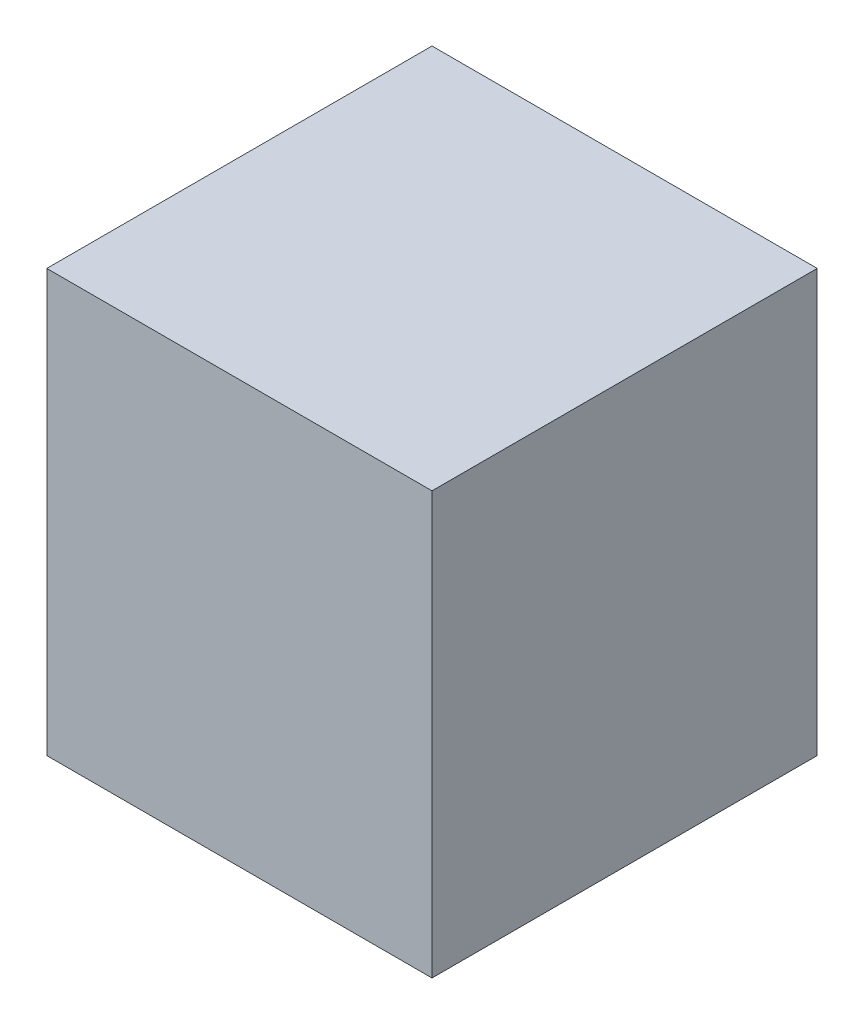
ISO-10303-21;
HEADER;
FILE_DESCRIPTION(('STEP AP214'),'2;1');
FILE_NAME('part.step','',(''),(''),'','','');
FILE_SCHEMA(('AUTOMOTIVE_DESIGN { 1 0 10303 214 1 1 1 1 }'));
ENDSEC;
DATA;
#1=APPLICATION_CONTEXT('core data for automotive mechanical design processes');
#2=APPLICATION_PROTOCOL_DEFINITION('international standard','automotive_design',2000,#1);
#3=PRODUCT_CONTEXT('',#1,'mechanical');
#4=PRODUCT('Part','Part','',(#3));
#5=PRODUCT_RELATED_PRODUCT_CATEGORY('part','',(#4));
#6=PRODUCT_DEFINITION_FORMATION('','',#4);
#7=PRODUCT_DEFINITION_CONTEXT('part definition',#1,'design');
#8=PRODUCT_DEFINITION('design','',#6,#7);
#9=PRODUCT_DEFINITION_SHAPE('','',#8);
#10=(LENGTH_UNIT() NAMED_UNIT(*) SI_UNIT(.MILLI.,.METRE.));
#11=(NAMED_UNIT(*) PLANE_ANGLE_UNIT() SI_UNIT($,.RADIAN.));
#12=(NAMED_UNIT(*) SI_UNIT($,.STERADIAN.) SOLID_ANGLE_UNIT());
#13=UNCERTAINTY_MEASURE_WITH_UNIT(LENGTH_MEASURE(1.E-05),#10,'distance_accuracy_value','');
#14=(GEOMETRIC_REPRESENTATION_CONTEXT(3) GLOBAL_UNCERTAINTY_ASSIGNED_CONTEXT((#13)) GLOBAL_UNIT_ASSIGNED_CONTEXT((#10,
#11,#12)) REPRESENTATION_CONTEXT('',''));
#15=CARTESIAN_POINT('',(0.,0.,0.));
#16=DIRECTION('',(0.,0.,1.));
#17=DIRECTION('',(1.,0.,0.));
#18=AXIS2_PLACEMENT_3D('',#15,#16,#17);
#19=CARTESIAN_POINT('',(0.,46.,0.));
#20=DIRECTION('',(1.,0.,0.));
#21=DIRECTION('',(0.,0.,-1.));
#22=AXIS2_PLACEMENT_3D('',#19,#20,#21);
#23=PLANE('',#22);
#24=DIRECTION('',(0.,0.,1.));
#25=VECTOR('',#24,1.);
#26=CARTESIAN_POINT('',(0.,0.,0.));
#27=LINE('',#26,#25);
#28=CARTESIAN_POINT('',(0.,0.,-42.));
#29=VERTEX_POINT('',#28);
#30=CARTESIAN_POINT('',(0.,0.,0.));
#31=VERTEX_POINT('',#30);
#32=EDGE_CURVE('E113',#29,#31,#27,.T.);
#33=ORIENTED_EDGE('',*,*,#32,.T.);
#34=DIRECTION('',(0.,-1.,0.));
#35=VECTOR('',#34,1.);
#36=CARTESIAN_POINT('',(0.,46.,0.));
#37=LINE('',#36,#35);
#38=CARTESIAN_POINT('',(0.,46.,0.));
#39=VERTEX_POINT('',#38);
#40=EDGE_CURVE('E11',#39,#31,#37,.T.);
#41=ORIENTED_EDGE('',*,*,#40,.F.);
#42=DIRECTION('',(0.,0.,1.));
#43=VECTOR('',#42,1.);
#44=CARTESIAN_POINT('',(0.,46.,0.));
#45=LINE('',#44,#43);
#46=CARTESIAN_POINT('',(0.,46.,-42.));
#47=VERTEX_POINT('',#46);
#48=EDGE_CURVE('E97',#47,#39,#45,.T.);
#49=ORIENTED_EDGE('',*,*,#48,.F.);
#50=DIRECTION('',(0.,-1.,0.));
#51=VECTOR('',#50,1.);
#52=CARTESIAN_POINT('',(0.,46.,-42.));
#53=LINE('',#52,#51);
#54=EDGE_CURVE('E109',#47,#29,#53,.T.);
#55=ORIENTED_EDGE('',*,*,#54,.T.);
#56=EDGE_LOOP('',(#33,#41,#49,#55));
#57=FACE_BOUND('',#56,.T.);
#58=ADVANCED_FACE('F45',(#57),#23,.F.);
#59=CARTESIAN_POINT('',(0.,46.,0.));
#60=DIRECTION('',(0.,0.,-1.));
#61=DIRECTION('',(-1.,0.,0.));
#62=AXIS2_PLACEMENT_3D('',#59,#60,#61);
#63=PLANE('',#62);
#64=DIRECTION('',(1.,0.,0.));
#65=VECTOR('',#64,1.);
#66=CARTESIAN_POINT('',(0.,0.,0.));
#67=LINE('',#66,#65);
#68=CARTESIAN_POINT('',(42.,0.,0.));
#69=VERTEX_POINT('',#68);
#70=EDGE_CURVE('E102',#31,#69,#67,.T.);
#71=ORIENTED_EDGE('',*,*,#70,.T.);
#72=DIRECTION('',(0.,-1.,0.));
#73=VECTOR('',#72,1.);
#74=CARTESIAN_POINT('',(42.,46.,0.));
#75=LINE('',#74,#73);
#76=CARTESIAN_POINT('',(42.,46.,0.));
#77=VERTEX_POINT('',#76);
#78=EDGE_CURVE('E54',#77,#69,#75,.T.);
#79=ORIENTED_EDGE('',*,*,#78,.F.);
#80=DIRECTION('',(1.,0.,0.));
#81=VECTOR('',#80,1.);
#82=CARTESIAN_POINT('',(0.,46.,0.));
#83=LINE('',#82,#81);
#84=EDGE_CURVE('E92',#39,#77,#83,.T.);
#85=ORIENTED_EDGE('',*,*,#84,.F.);
#86=ORIENTED_EDGE('',*,*,#40,.T.);
#87=EDGE_LOOP('',(#71,#79,#85,#86));
#88=FACE_BOUND('',#87,.T.);
#89=ADVANCED_FACE('F101',(#88),#63,.F.);
#90=CARTESIAN_POINT('',(42.,46.,0.));
#91=DIRECTION('',(-1.,0.,0.));
#92=DIRECTION('',(0.,0.,1.));
#93=AXIS2_PLACEMENT_3D('',#90,#91,#92);
#94=PLANE('',#93);
#95=DIRECTION('',(0.,0.,-1.));
#96=VECTOR('',#95,1.);
#97=CARTESIAN_POINT('',(42.,0.,0.));
#98=LINE('',#97,#96);
#99=CARTESIAN_POINT('',(42.,0.,-42.));
#100=VERTEX_POINT('',#99);
#101=EDGE_CURVE('E79',#69,#100,#98,.T.);
#102=ORIENTED_EDGE('',*,*,#101,.T.);
#103=DIRECTION('',(0.,-1.,0.));
#104=VECTOR('',#103,1.);
#105=CARTESIAN_POINT('',(42.,46.,-42.));
#106=LINE('',#105,#104);
#107=CARTESIAN_POINT('',(42.,46.,-42.));
#108=VERTEX_POINT('',#107);
#109=EDGE_CURVE('E104',#108,#100,#106,.T.);
#110=ORIENTED_EDGE('',*,*,#109,.F.);
#111=DIRECTION('',(0.,0.,-1.));
#112=VECTOR('',#111,1.);
#113=CARTESIAN_POINT('',(42.,46.,0.));
#114=LINE('',#113,#112);
#115=EDGE_CURVE('E95',#77,#108,#114,.T.);
#116=ORIENTED_EDGE('',*,*,#115,.F.);
#117=ORIENTED_EDGE('',*,*,#78,.T.);
#118=EDGE_LOOP('',(#102,#110,#116,#117));
#119=FACE_BOUND('',#118,.T.);
#120=ADVANCED_FACE('F105',(#119),#94,.F.);
#121=CARTESIAN_POINT('',(0.,46.,-42.));
#122=DIRECTION('',(0.,0.,1.));
#123=DIRECTION('',(1.,0.,0.));
#124=AXIS2_PLACEMENT_3D('',#121,#122,#123);
#125=PLANE('',#124);
#126=DIRECTION('',(-1.,0.,0.));
#127=VECTOR('',#126,1.);
#128=CARTESIAN_POINT('',(0.,0.,-42.));
#129=LINE('',#128,#127);
#130=EDGE_CURVE('E85',#100,#29,#129,.T.);
#131=ORIENTED_EDGE('',*,*,#130,.T.);
#132=ORIENTED_EDGE('',*,*,#54,.F.);
#133=DIRECTION('',(-1.,0.,0.));
#134=VECTOR('',#133,1.);
#135=CARTESIAN_POINT('',(0.,46.,-42.));
#136=LINE('',#135,#134);
#137=EDGE_CURVE('E62',#108,#47,#136,.T.);
#138=ORIENTED_EDGE('',*,*,#137,.F.);
#139=ORIENTED_EDGE('',*,*,#109,.T.);
#140=EDGE_LOOP('',(#131,#132,#138,#139));
#141=FACE_BOUND('',#140,.T.);
#142=ADVANCED_FACE('F126',(#141),#125,.F.);
#143=CARTESIAN_POINT('',(0.,46.,0.));
#144=DIRECTION('',(0.,-1.,0.));
#145=DIRECTION('',(0.,0.,-1.));
#146=AXIS2_PLACEMENT_3D('',#143,#144,#145);
#147=PLANE('',#146);
#148=ORIENTED_EDGE('',*,*,#48,.T.);
#149=ORIENTED_EDGE('',*,*,#84,.T.);
#150=ORIENTED_EDGE('',*,*,#115,.T.);
#151=ORIENTED_EDGE('',*,*,#137,.T.);
#152=EDGE_LOOP('',(#148,#149,#150,#151));
#153=FACE_BOUND('',#152,.T.);
#154=ADVANCED_FACE('F93',(#153),#147,.F.);
#155=CARTESIAN_POINT('',(0.,0.,0.));
#156=DIRECTION('',(0.,-1.,0.));
#157=DIRECTION('',(0.,0.,-1.));
#158=AXIS2_PLACEMENT_3D('',#155,#156,#157);
#159=PLANE('',#158);
#160=ORIENTED_EDGE('',*,*,#32,.F.);
#161=ORIENTED_EDGE('',*,*,#130,.F.);
#162=ORIENTED_EDGE('',*,*,#101,.F.);
#163=ORIENTED_EDGE('',*,*,#70,.F.);
#164=EDGE_LOOP('',(#160,#161,#162,#163));
#165=FACE_BOUND('',#164,.T.);
#166=ADVANCED_FACE('F129',(#165),#159,.T.);
#167=CLOSED_SHELL('',(#58,#89,#120,#142,#154,#166));
#168=MANIFOLD_SOLID_BREP('B2',#167);
#169=ADVANCED_BREP_SHAPE_REPRESENTATION('',(#18,#168),#14);
#170=SHAPE_DEFINITION_REPRESENTATION(#9,#169);
ENDSEC;
END-ISO-10303-21;
